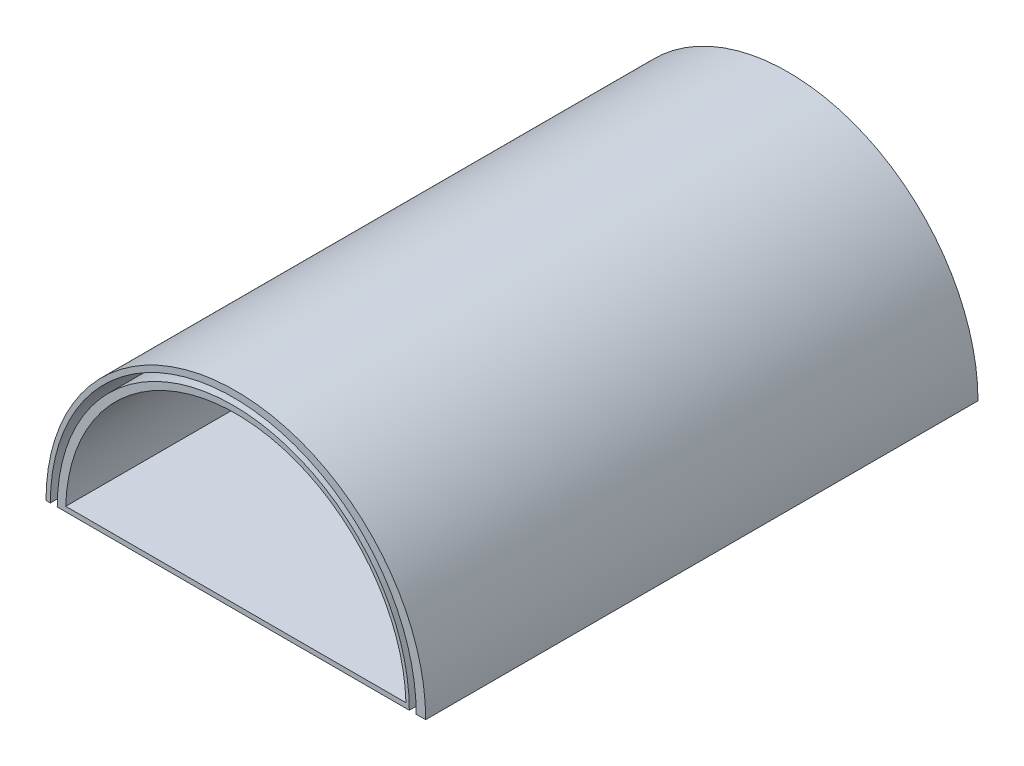
ISO-10303-21;
HEADER;
FILE_DESCRIPTION(('STEP AP214'),'2;1');
FILE_NAME('part.step','',(''),(''),'','','');
FILE_SCHEMA(('AUTOMOTIVE_DESIGN { 1 0 10303 214 1 1 1 1 }'));
ENDSEC;
DATA;
#1=APPLICATION_CONTEXT('core data for automotive mechanical design processes');
#2=APPLICATION_PROTOCOL_DEFINITION('international standard','automotive_design',2000,#1);
#3=PRODUCT_CONTEXT('',#1,'mechanical');
#4=PRODUCT('Part','Part','',(#3));
#5=PRODUCT_RELATED_PRODUCT_CATEGORY('part','',(#4));
#6=PRODUCT_DEFINITION_FORMATION('','',#4);
#7=PRODUCT_DEFINITION_CONTEXT('part definition',#1,'design');
#8=PRODUCT_DEFINITION('design','',#6,#7);
#9=PRODUCT_DEFINITION_SHAPE('','',#8);
#10=(LENGTH_UNIT() NAMED_UNIT(*) SI_UNIT(.MILLI.,.METRE.));
#11=(NAMED_UNIT(*) PLANE_ANGLE_UNIT() SI_UNIT($,.RADIAN.));
#12=(NAMED_UNIT(*) SI_UNIT($,.STERADIAN.) SOLID_ANGLE_UNIT());
#13=UNCERTAINTY_MEASURE_WITH_UNIT(LENGTH_MEASURE(1.E-05),#10,'distance_accuracy_value','');
#14=(GEOMETRIC_REPRESENTATION_CONTEXT(3) GLOBAL_UNCERTAINTY_ASSIGNED_CONTEXT((#13)) GLOBAL_UNIT_ASSIGNED_CONTEXT((#10,
#11,#12)) REPRESENTATION_CONTEXT('',''));
#15=CARTESIAN_POINT('',(0.,0.,0.));
#16=DIRECTION('',(0.,0.,1.));
#17=DIRECTION('',(1.,0.,0.));
#18=AXIS2_PLACEMENT_3D('',#15,#16,#17);
#19=CARTESIAN_POINT('',(0.,0.,203.2));
#20=DIRECTION('',(0.,0.,1.));
#21=DIRECTION('',(1.,0.,0.));
#22=AXIS2_PLACEMENT_3D('',#19,#20,#21);
#23=PLANE('',#22);
#24=CARTESIAN_POINT('',(-0.946701736803848,0.,203.2));
#25=DIRECTION('',(0.,0.,1.));
#26=DIRECTION('',(-1.,0.,0.));
#27=AXIS2_PLACEMENT_3D('',#24,#25,#26);
#28=CIRCLE('',#27,67.31);
#29=CARTESIAN_POINT('',(66.3632982631961,0.,203.2));
#30=VERTEX_POINT('',#29);
#31=CARTESIAN_POINT('',(-68.2567017368038,0.,203.2));
#32=VERTEX_POINT('',#31);
#33=EDGE_CURVE('E102',#30,#32,#28,.T.);
#34=ORIENTED_EDGE('',*,*,#33,.F.);
#35=DIRECTION('',(1.,0.,0.));
#36=VECTOR('',#35,1.);
#37=CARTESIAN_POINT('',(-69.85,0.,203.2));
#38=LINE('',#37,#36);
#39=CARTESIAN_POINT('',(69.85,0.,203.2));
#40=VERTEX_POINT('',#39);
#41=EDGE_CURVE('E151',#30,#40,#38,.T.);
#42=ORIENTED_EDGE('',*,*,#41,.T.);
#43=CARTESIAN_POINT('',(0.,0.,203.2));
#44=DIRECTION('',(0.,0.,1.));
#45=DIRECTION('',(1.,0.,0.));
#46=AXIS2_PLACEMENT_3D('',#43,#44,#45);
#47=CIRCLE('',#46,69.85);
#48=CARTESIAN_POINT('',(-69.85,0.,203.2));
#49=VERTEX_POINT('',#48);
#50=EDGE_CURVE('E148',#40,#49,#47,.T.);
#51=ORIENTED_EDGE('',*,*,#50,.T.);
#52=EDGE_CURVE('E153',#49,#32,#38,.T.);
#53=ORIENTED_EDGE('',*,*,#52,.T.);
#54=EDGE_LOOP('',(#34,#42,#51,#53));
#55=FACE_BOUND('',#54,.T.);
#56=ADVANCED_FACE('F32',(#55),#23,.T.);
#57=CARTESIAN_POINT('',(0.,0.,203.2));
#58=DIRECTION('',(0.,0.,-1.));
#59=DIRECTION('',(-1.,0.,0.));
#60=AXIS2_PLACEMENT_3D('',#57,#58,#59);
#61=CYLINDRICAL_SURFACE('',#60,69.85);
#62=CARTESIAN_POINT('',(0.,0.,0.));
#63=DIRECTION('',(0.,0.,1.));
#64=DIRECTION('',(1.,0.,0.));
#65=AXIS2_PLACEMENT_3D('',#62,#63,#64);
#66=CIRCLE('',#65,69.85);
#67=CARTESIAN_POINT('',(69.85,0.,0.));
#68=VERTEX_POINT('',#67);
#69=CARTESIAN_POINT('',(-69.85,0.,0.));
#70=VERTEX_POINT('',#69);
#71=EDGE_CURVE('E146',#68,#70,#66,.T.);
#72=ORIENTED_EDGE('',*,*,#71,.T.);
#73=DIRECTION('',(0.,0.,-1.));
#74=VECTOR('',#73,1.);
#75=CARTESIAN_POINT('',(-69.85,0.,203.2));
#76=LINE('',#75,#74);
#77=EDGE_CURVE('E11',#49,#70,#76,.T.);
#78=ORIENTED_EDGE('',*,*,#77,.F.);
#79=ORIENTED_EDGE('',*,*,#50,.F.);
#80=DIRECTION('',(0.,0.,-1.));
#81=VECTOR('',#80,1.);
#82=CARTESIAN_POINT('',(69.85,0.,203.2));
#83=LINE('',#82,#81);
#84=EDGE_CURVE('E40',#40,#68,#83,.T.);
#85=ORIENTED_EDGE('',*,*,#84,.T.);
#86=EDGE_LOOP('',(#72,#78,#79,#85));
#87=FACE_BOUND('',#86,.T.);
#88=ADVANCED_FACE('F34',(#87),#61,.T.);
#89=CARTESIAN_POINT('',(-69.85,0.,203.2));
#90=DIRECTION('',(0.,1.,0.));
#91=DIRECTION('',(0.,0.,1.));
#92=AXIS2_PLACEMENT_3D('',#89,#90,#91);
#93=PLANE('',#92);
#94=ORIENTED_EDGE('',*,*,#41,.F.);
#95=DIRECTION('',(0.,0.,1.));
#96=VECTOR('',#95,1.);
#97=CARTESIAN_POINT('',(66.3632982631961,0.,101.6));
#98=LINE('',#97,#96);
#99=CARTESIAN_POINT('',(66.3632982631961,0.,101.6));
#100=VERTEX_POINT('',#99);
#101=EDGE_CURVE('E127',#100,#30,#98,.T.);
#102=ORIENTED_EDGE('',*,*,#101,.F.);
#103=DIRECTION('',(1.,0.,0.));
#104=VECTOR('',#103,1.);
#105=CARTESIAN_POINT('',(66.3632982631961,0.,101.6));
#106=LINE('',#105,#104);
#107=CARTESIAN_POINT('',(63.8232982631961,0.,101.6));
#108=VERTEX_POINT('',#107);
#109=EDGE_CURVE('E106',#108,#100,#106,.T.);
#110=ORIENTED_EDGE('',*,*,#109,.F.);
#111=DIRECTION('',(0.,0.,1.));
#112=VECTOR('',#111,1.);
#113=CARTESIAN_POINT('',(63.8232982631961,0.,101.6));
#114=LINE('',#113,#112);
#115=CARTESIAN_POINT('',(63.8232982631961,0.,203.2));
#116=VERTEX_POINT('',#115);
#117=EDGE_CURVE('E129',#108,#116,#114,.T.);
#118=ORIENTED_EDGE('',*,*,#117,.T.);
#119=CARTESIAN_POINT('',(-65.7167017368038,0.,203.2));
#120=VERTEX_POINT('',#119);
#121=EDGE_CURVE('E155',#120,#116,#38,.T.);
#122=ORIENTED_EDGE('',*,*,#121,.F.);
#123=DIRECTION('',(0.,0.,1.));
#124=VECTOR('',#123,1.);
#125=CARTESIAN_POINT('',(-65.7167017368038,0.,101.6));
#126=LINE('',#125,#124);
#127=CARTESIAN_POINT('',(-65.7167017368038,0.,101.6));
#128=VERTEX_POINT('',#127);
#129=EDGE_CURVE('E47',#128,#120,#126,.T.);
#130=ORIENTED_EDGE('',*,*,#129,.F.);
#131=DIRECTION('',(1.,0.,0.));
#132=VECTOR('',#131,1.);
#133=CARTESIAN_POINT('',(-65.7167017368038,0.,101.6));
#134=LINE('',#133,#132);
#135=CARTESIAN_POINT('',(-68.2567017368038,0.,101.6));
#136=VERTEX_POINT('',#135);
#137=EDGE_CURVE('E112',#136,#128,#134,.T.);
#138=ORIENTED_EDGE('',*,*,#137,.F.);
#139=DIRECTION('',(0.,0.,1.));
#140=VECTOR('',#139,1.);
#141=CARTESIAN_POINT('',(-68.2567017368038,0.,101.6));
#142=LINE('',#141,#140);
#143=EDGE_CURVE('E96',#136,#32,#142,.T.);
#144=ORIENTED_EDGE('',*,*,#143,.T.);
#145=ORIENTED_EDGE('',*,*,#52,.F.);
#146=ORIENTED_EDGE('',*,*,#77,.T.);
#147=DIRECTION('',(1.,0.,0.));
#148=VECTOR('',#147,1.);
#149=CARTESIAN_POINT('',(-69.85,0.,0.));
#150=LINE('',#149,#148);
#151=EDGE_CURVE('E152',#70,#68,#150,.T.);
#152=ORIENTED_EDGE('',*,*,#151,.T.);
#153=ORIENTED_EDGE('',*,*,#84,.F.);
#154=EDGE_LOOP('',(#94,#102,#110,#118,#122,#130,#138,#144,#145,#146,#152,#153));
#155=FACE_BOUND('',#154,.T.);
#156=ADVANCED_FACE('F118',(#155),#93,.F.);
#157=CARTESIAN_POINT('',(-0.946701736803848,0.,203.2));
#158=DIRECTION('',(0.,0.,-1.));
#159=DIRECTION('',(-1.,0.,0.));
#160=AXIS2_PLACEMENT_3D('',#157,#158,#159);
#161=CIRCLE('',#160,64.77);
#162=EDGE_CURVE('E115',#120,#116,#161,.T.);
#163=ORIENTED_EDGE('',*,*,#162,.F.);
#164=ORIENTED_EDGE('',*,*,#121,.T.);
#165=EDGE_LOOP('',(#163,#164));
#166=FACE_BOUND('',#165,.T.);
#167=CARTESIAN_POINT('',(0.,0.,203.2));
#168=DIRECTION('',(0.,0.,1.));
#169=DIRECTION('',(1.,0.,0.));
#170=AXIS2_PLACEMENT_3D('',#167,#168,#169);
#171=CIRCLE('',#170,62.611);
#172=CARTESIAN_POINT('',(62.5857494722241,1.778,203.2));
#173=VERTEX_POINT('',#172);
#174=CARTESIAN_POINT('',(-62.5857494722241,1.778,203.2));
#175=VERTEX_POINT('',#174);
#176=EDGE_CURVE('E55',#173,#175,#171,.T.);
#177=ORIENTED_EDGE('',*,*,#176,.F.);
#178=DIRECTION('',(1.,0.,0.));
#179=VECTOR('',#178,1.);
#180=CARTESIAN_POINT('',(-62.5857494722241,1.778,203.2));
#181=LINE('',#180,#179);
#182=EDGE_CURVE('E137',#175,#173,#181,.T.);
#183=ORIENTED_EDGE('',*,*,#182,.F.);
#184=EDGE_LOOP('',(#177,#183));
#185=FACE_BOUND('',#184,.T.);
#186=ADVANCED_FACE('F169',(#166,#185),#23,.T.);
#187=CARTESIAN_POINT('',(0.,0.,0.));
#188=DIRECTION('',(0.,0.,1.));
#189=DIRECTION('',(1.,0.,0.));
#190=AXIS2_PLACEMENT_3D('',#187,#188,#189);
#191=PLANE('',#190);
#192=ORIENTED_EDGE('',*,*,#71,.F.);
#193=ORIENTED_EDGE('',*,*,#151,.F.);
#194=EDGE_LOOP('',(#192,#193));
#195=FACE_BOUND('',#194,.T.);
#196=ADVANCED_FACE('F165',(#195),#191,.F.);
#197=CARTESIAN_POINT('',(0.,0.,1.778));
#198=DIRECTION('',(0.,0.,1.));
#199=DIRECTION('',(1.,0.,0.));
#200=AXIS2_PLACEMENT_3D('',#197,#198,#199);
#201=CYLINDRICAL_SURFACE('',#200,62.611);
#202=ORIENTED_EDGE('',*,*,#176,.T.);
#203=DIRECTION('',(0.,0.,1.));
#204=VECTOR('',#203,1.);
#205=CARTESIAN_POINT('',(-62.5857494722241,1.778,1.778));
#206=LINE('',#205,#204);
#207=CARTESIAN_POINT('',(-62.5857494722241,1.778,1.778));
#208=VERTEX_POINT('',#207);
#209=EDGE_CURVE('E140',#208,#175,#206,.T.);
#210=ORIENTED_EDGE('',*,*,#209,.F.);
#211=CARTESIAN_POINT('',(0.,0.,1.778));
#212=DIRECTION('',(0.,0.,1.));
#213=DIRECTION('',(1.,0.,0.));
#214=AXIS2_PLACEMENT_3D('',#211,#212,#213);
#215=CIRCLE('',#214,62.611);
#216=CARTESIAN_POINT('',(62.5857494722241,1.778,1.778));
#217=VERTEX_POINT('',#216);
#218=EDGE_CURVE('E133',#217,#208,#215,.T.);
#219=ORIENTED_EDGE('',*,*,#218,.F.);
#220=DIRECTION('',(0.,0.,1.));
#221=VECTOR('',#220,1.);
#222=CARTESIAN_POINT('',(62.5857494722241,1.778,1.778));
#223=LINE('',#222,#221);
#224=EDGE_CURVE('E144',#217,#173,#223,.T.);
#225=ORIENTED_EDGE('',*,*,#224,.T.);
#226=EDGE_LOOP('',(#202,#210,#219,#225));
#227=FACE_BOUND('',#226,.T.);
#228=ADVANCED_FACE('F193',(#227),#201,.F.);
#229=CARTESIAN_POINT('',(-62.5857494722241,1.778,1.778));
#230=DIRECTION('',(0.,-1.,0.));
#231=DIRECTION('',(0.,0.,-1.));
#232=AXIS2_PLACEMENT_3D('',#229,#230,#231);
#233=PLANE('',#232);
#234=ORIENTED_EDGE('',*,*,#182,.T.);
#235=ORIENTED_EDGE('',*,*,#224,.F.);
#236=DIRECTION('',(1.,0.,0.));
#237=VECTOR('',#236,1.);
#238=CARTESIAN_POINT('',(-62.5857494722241,1.778,1.778));
#239=LINE('',#238,#237);
#240=EDGE_CURVE('E136',#208,#217,#239,.T.);
#241=ORIENTED_EDGE('',*,*,#240,.F.);
#242=ORIENTED_EDGE('',*,*,#209,.T.);
#243=EDGE_LOOP('',(#234,#235,#241,#242));
#244=FACE_BOUND('',#243,.T.);
#245=ADVANCED_FACE('F216',(#244),#233,.F.);
#246=CARTESIAN_POINT('',(0.,0.,1.778));
#247=DIRECTION('',(0.,0.,1.));
#248=DIRECTION('',(1.,0.,0.));
#249=AXIS2_PLACEMENT_3D('',#246,#247,#248);
#250=PLANE('',#249);
#251=ORIENTED_EDGE('',*,*,#218,.T.);
#252=ORIENTED_EDGE('',*,*,#240,.T.);
#253=EDGE_LOOP('',(#251,#252));
#254=FACE_BOUND('',#253,.T.);
#255=ADVANCED_FACE('F179',(#254),#250,.T.);
#256=CARTESIAN_POINT('',(-0.946701736803848,0.,101.6));
#257=DIRECTION('',(0.,0.,1.));
#258=DIRECTION('',(1.,0.,0.));
#259=AXIS2_PLACEMENT_3D('',#256,#257,#258);
#260=CYLINDRICAL_SURFACE('',#259,67.31);
#261=ORIENTED_EDGE('',*,*,#33,.T.);
#262=ORIENTED_EDGE('',*,*,#143,.F.);
#263=CARTESIAN_POINT('',(-0.946701736803848,0.,101.6));
#264=DIRECTION('',(0.,0.,1.));
#265=DIRECTION('',(-1.,0.,0.));
#266=AXIS2_PLACEMENT_3D('',#263,#264,#265);
#267=CIRCLE('',#266,67.31);
#268=EDGE_CURVE('E99',#100,#136,#267,.T.);
#269=ORIENTED_EDGE('',*,*,#268,.F.);
#270=ORIENTED_EDGE('',*,*,#101,.T.);
#271=EDGE_LOOP('',(#261,#262,#269,#270));
#272=FACE_BOUND('',#271,.T.);
#273=ADVANCED_FACE('F98',(#272),#260,.F.);
#274=CARTESIAN_POINT('',(-0.946701736803848,0.,101.6));
#275=DIRECTION('',(0.,0.,1.));
#276=DIRECTION('',(1.,0.,0.));
#277=AXIS2_PLACEMENT_3D('',#274,#275,#276);
#278=CYLINDRICAL_SURFACE('',#277,64.77);
#279=ORIENTED_EDGE('',*,*,#162,.T.);
#280=ORIENTED_EDGE('',*,*,#117,.F.);
#281=CARTESIAN_POINT('',(-0.946701736803848,0.,101.6));
#282=DIRECTION('',(0.,0.,-1.));
#283=DIRECTION('',(-1.,0.,0.));
#284=AXIS2_PLACEMENT_3D('',#281,#282,#283);
#285=CIRCLE('',#284,64.77);
#286=EDGE_CURVE('E120',#128,#108,#285,.T.);
#287=ORIENTED_EDGE('',*,*,#286,.F.);
#288=ORIENTED_EDGE('',*,*,#129,.T.);
#289=EDGE_LOOP('',(#279,#280,#287,#288));
#290=FACE_BOUND('',#289,.T.);
#291=ADVANCED_FACE('F171',(#290),#278,.T.);
#292=CARTESIAN_POINT('',(-0.946701736803848,0.,101.6));
#293=DIRECTION('',(0.,0.,-1.));
#294=DIRECTION('',(-1.,0.,0.));
#295=AXIS2_PLACEMENT_3D('',#292,#293,#294);
#296=PLANE('',#295);
#297=ORIENTED_EDGE('',*,*,#268,.T.);
#298=ORIENTED_EDGE('',*,*,#137,.T.);
#299=ORIENTED_EDGE('',*,*,#286,.T.);
#300=ORIENTED_EDGE('',*,*,#109,.T.);
#301=EDGE_LOOP('',(#297,#298,#299,#300));
#302=FACE_BOUND('',#301,.T.);
#303=ADVANCED_FACE('F110',(#302),#296,.F.);
#304=CLOSED_SHELL('',(#56,#88,#156,#186,#196,#228,#245,#255,#273,#291,#303));
#305=MANIFOLD_SOLID_BREP('B2',#304);
#306=ADVANCED_BREP_SHAPE_REPRESENTATION('',(#18,#305),#14);
#307=SHAPE_DEFINITION_REPRESENTATION(#9,#306);
ENDSEC;
END-ISO-10303-21;
